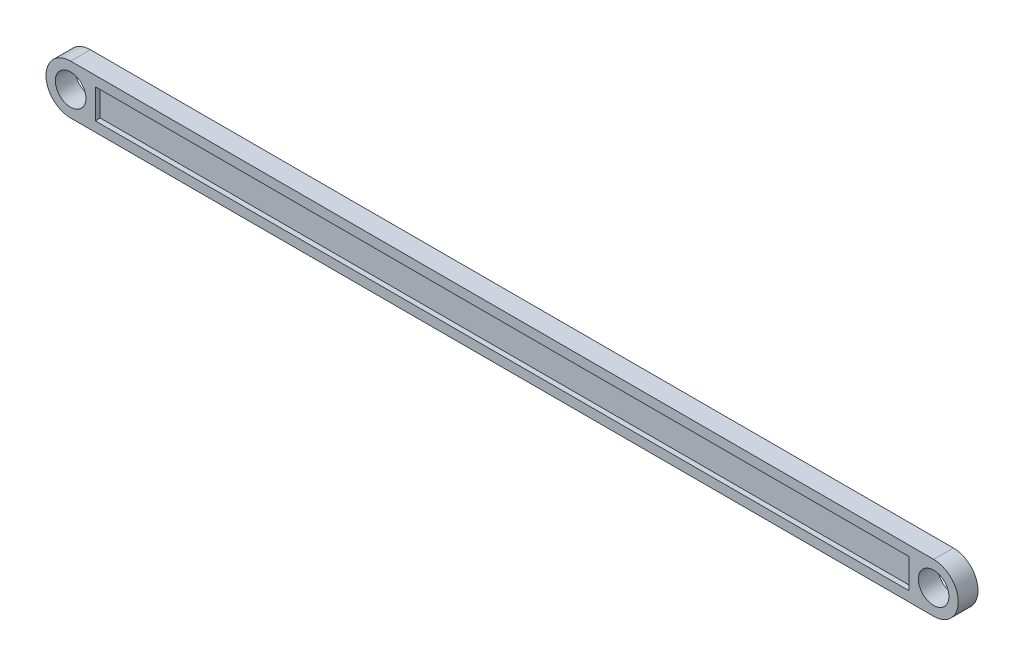
ISO-10303-21;
HEADER;
FILE_DESCRIPTION(('STEP AP214'),'2;1');
FILE_NAME('part.step','',(''),(''),'','','');
FILE_SCHEMA(('AUTOMOTIVE_DESIGN { 1 0 10303 214 1 1 1 1 }'));
ENDSEC;
DATA;
#1=APPLICATION_CONTEXT('core data for automotive mechanical design processes');
#2=APPLICATION_PROTOCOL_DEFINITION('international standard','automotive_design',2000,#1);
#3=PRODUCT_CONTEXT('',#1,'mechanical');
#4=PRODUCT('Part','Part','',(#3));
#5=PRODUCT_RELATED_PRODUCT_CATEGORY('part','',(#4));
#6=PRODUCT_DEFINITION_FORMATION('','',#4);
#7=PRODUCT_DEFINITION_CONTEXT('part definition',#1,'design');
#8=PRODUCT_DEFINITION('design','',#6,#7);
#9=PRODUCT_DEFINITION_SHAPE('','',#8);
#10=(LENGTH_UNIT() NAMED_UNIT(*) SI_UNIT(.MILLI.,.METRE.));
#11=(NAMED_UNIT(*) PLANE_ANGLE_UNIT() SI_UNIT($,.RADIAN.));
#12=(NAMED_UNIT(*) SI_UNIT($,.STERADIAN.) SOLID_ANGLE_UNIT());
#13=UNCERTAINTY_MEASURE_WITH_UNIT(LENGTH_MEASURE(1.E-05),#10,'distance_accuracy_value','');
#14=(GEOMETRIC_REPRESENTATION_CONTEXT(3) GLOBAL_UNCERTAINTY_ASSIGNED_CONTEXT((#13)) GLOBAL_UNIT_ASSIGNED_CONTEXT((#10,
#11,#12)) REPRESENTATION_CONTEXT('',''));
#15=CARTESIAN_POINT('',(0.,0.,0.));
#16=DIRECTION('',(0.,0.,1.));
#17=DIRECTION('',(1.,0.,0.));
#18=AXIS2_PLACEMENT_3D('',#15,#16,#17);
#19=CARTESIAN_POINT('',(175.,0.,4.));
#20=DIRECTION('',(0.,0.,1.));
#21=DIRECTION('',(1.,0.,0.));
#22=AXIS2_PLACEMENT_3D('',#19,#20,#21);
#23=PLANE('',#22);
#24=DIRECTION('',(0.,-1.,0.));
#25=VECTOR('',#24,1.);
#26=CARTESIAN_POINT('',(5.,-3.,4.));
#27=LINE('',#26,#25);
#28=CARTESIAN_POINT('',(5.,2.99999999999999,4.));
#29=VERTEX_POINT('',#28);
#30=CARTESIAN_POINT('',(5.,-3.,4.));
#31=VERTEX_POINT('',#30);
#32=EDGE_CURVE('E57',#29,#31,#27,.T.);
#33=ORIENTED_EDGE('',*,*,#32,.F.);
#34=DIRECTION('',(-1.,0.,0.));
#35=VECTOR('',#34,1.);
#36=CARTESIAN_POINT('',(5.,2.99999999999999,4.));
#37=LINE('',#36,#35);
#38=CARTESIAN_POINT('',(170.,2.99999999999999,4.));
#39=VERTEX_POINT('',#38);
#40=EDGE_CURVE('E165',#39,#29,#37,.T.);
#41=ORIENTED_EDGE('',*,*,#40,.F.);
#42=DIRECTION('',(0.,1.,0.));
#43=VECTOR('',#42,1.);
#44=CARTESIAN_POINT('',(170.,-3.,4.));
#45=LINE('',#44,#43);
#46=CARTESIAN_POINT('',(170.,-3.,4.));
#47=VERTEX_POINT('',#46);
#48=EDGE_CURVE('E179',#47,#39,#45,.T.);
#49=ORIENTED_EDGE('',*,*,#48,.F.);
#50=DIRECTION('',(1.,0.,0.));
#51=VECTOR('',#50,1.);
#52=CARTESIAN_POINT('',(5.,-3.,4.));
#53=LINE('',#52,#51);
#54=EDGE_CURVE('E176',#31,#47,#53,.T.);
#55=ORIENTED_EDGE('',*,*,#54,.F.);
#56=EDGE_LOOP('',(#33,#41,#49,#55));
#57=FACE_BOUND('',#56,.T.);
#58=CARTESIAN_POINT('',(0.,0.,4.));
#59=DIRECTION('',(0.,0.,1.));
#60=DIRECTION('',(1.,0.,0.));
#61=AXIS2_PLACEMENT_3D('',#58,#59,#60);
#62=CIRCLE('',#61,3.1);
#63=CARTESIAN_POINT('',(3.1,0.,4.));
#64=VERTEX_POINT('',#63);
#65=EDGE_CURVE('E198',#64,#64,#62,.T.);
#66=ORIENTED_EDGE('',*,*,#65,.F.);
#67=EDGE_LOOP('',(#66));
#68=FACE_BOUND('',#67,.T.);
#69=CARTESIAN_POINT('',(175.,0.,4.));
#70=DIRECTION('',(0.,0.,1.));
#71=DIRECTION('',(1.,0.,0.));
#72=AXIS2_PLACEMENT_3D('',#69,#70,#71);
#73=CIRCLE('',#72,4.99999999999999);
#74=CARTESIAN_POINT('',(175.,-4.99999999999999,4.));
#75=VERTEX_POINT('',#74);
#76=CARTESIAN_POINT('',(175.,4.99999999999999,4.));
#77=VERTEX_POINT('',#76);
#78=EDGE_CURVE('E204',#75,#77,#73,.T.);
#79=ORIENTED_EDGE('',*,*,#78,.T.);
#80=DIRECTION('',(-1.,0.,0.));
#81=VECTOR('',#80,1.);
#82=CARTESIAN_POINT('',(0.,5.,4.));
#83=LINE('',#82,#81);
#84=CARTESIAN_POINT('',(0.,5.,4.));
#85=VERTEX_POINT('',#84);
#86=EDGE_CURVE('E207',#77,#85,#83,.T.);
#87=ORIENTED_EDGE('',*,*,#86,.T.);
#88=CARTESIAN_POINT('',(0.,0.,4.));
#89=DIRECTION('',(0.,0.,1.));
#90=DIRECTION('',(1.,0.,0.));
#91=AXIS2_PLACEMENT_3D('',#88,#89,#90);
#92=CIRCLE('',#91,5.);
#93=CARTESIAN_POINT('',(0.,-5.,4.));
#94=VERTEX_POINT('',#93);
#95=EDGE_CURVE('E210',#85,#94,#92,.T.);
#96=ORIENTED_EDGE('',*,*,#95,.T.);
#97=DIRECTION('',(1.,0.,0.));
#98=VECTOR('',#97,1.);
#99=CARTESIAN_POINT('',(175.,-4.99999999999999,4.));
#100=LINE('',#99,#98);
#101=EDGE_CURVE('E212',#94,#75,#100,.T.);
#102=ORIENTED_EDGE('',*,*,#101,.T.);
#103=EDGE_LOOP('',(#79,#87,#96,#102));
#104=FACE_BOUND('',#103,.T.);
#105=CARTESIAN_POINT('',(175.,0.,4.));
#106=DIRECTION('',(0.,0.,1.));
#107=DIRECTION('',(1.,0.,0.));
#108=AXIS2_PLACEMENT_3D('',#105,#106,#107);
#109=CIRCLE('',#108,3.09999999999999);
#110=CARTESIAN_POINT('',(178.1,0.,4.));
#111=VERTEX_POINT('',#110);
#112=EDGE_CURVE('E192',#111,#111,#109,.T.);
#113=ORIENTED_EDGE('',*,*,#112,.F.);
#114=EDGE_LOOP('',(#113));
#115=FACE_BOUND('',#114,.T.);
#116=ADVANCED_FACE('F34',(#57,#68,#104,#115),#23,.T.);
#117=CARTESIAN_POINT('',(175.,0.,0.));
#118=DIRECTION('',(0.,0.,1.));
#119=DIRECTION('',(1.,0.,0.));
#120=AXIS2_PLACEMENT_3D('',#117,#118,#119);
#121=PLANE('',#120);
#122=DIRECTION('',(-1.,0.,0.));
#123=VECTOR('',#122,1.);
#124=CARTESIAN_POINT('',(170.,-3.,0.));
#125=LINE('',#124,#123);
#126=CARTESIAN_POINT('',(170.,-3.,0.));
#127=VERTEX_POINT('',#126);
#128=CARTESIAN_POINT('',(5.,-3.,0.));
#129=VERTEX_POINT('',#128);
#130=EDGE_CURVE('E152',#127,#129,#125,.T.);
#131=ORIENTED_EDGE('',*,*,#130,.F.);
#132=DIRECTION('',(0.,-1.,0.));
#133=VECTOR('',#132,1.);
#134=CARTESIAN_POINT('',(170.,-3.,0.));
#135=LINE('',#134,#133);
#136=CARTESIAN_POINT('',(170.,2.99999999999999,0.));
#137=VERTEX_POINT('',#136);
#138=EDGE_CURVE('E49',#137,#127,#135,.T.);
#139=ORIENTED_EDGE('',*,*,#138,.F.);
#140=DIRECTION('',(1.,0.,0.));
#141=VECTOR('',#140,1.);
#142=CARTESIAN_POINT('',(170.,2.99999999999999,0.));
#143=LINE('',#142,#141);
#144=CARTESIAN_POINT('',(5.,2.99999999999999,0.));
#145=VERTEX_POINT('',#144);
#146=EDGE_CURVE('E143',#145,#137,#143,.T.);
#147=ORIENTED_EDGE('',*,*,#146,.F.);
#148=DIRECTION('',(0.,1.,0.));
#149=VECTOR('',#148,1.);
#150=CARTESIAN_POINT('',(5.,-3.,0.));
#151=LINE('',#150,#149);
#152=EDGE_CURVE('E146',#129,#145,#151,.T.);
#153=ORIENTED_EDGE('',*,*,#152,.F.);
#154=EDGE_LOOP('',(#131,#139,#147,#153));
#155=FACE_BOUND('',#154,.T.);
#156=CARTESIAN_POINT('',(175.,0.,0.));
#157=DIRECTION('',(0.,0.,1.));
#158=DIRECTION('',(1.,0.,0.));
#159=AXIS2_PLACEMENT_3D('',#156,#157,#158);
#160=CIRCLE('',#159,4.99999999999999);
#161=CARTESIAN_POINT('',(175.,-4.99999999999999,0.));
#162=VERTEX_POINT('',#161);
#163=CARTESIAN_POINT('',(175.,4.99999999999999,0.));
#164=VERTEX_POINT('',#163);
#165=EDGE_CURVE('E201',#162,#164,#160,.T.);
#166=ORIENTED_EDGE('',*,*,#165,.F.);
#167=DIRECTION('',(1.,0.,0.));
#168=VECTOR('',#167,1.);
#169=CARTESIAN_POINT('',(175.,-4.99999999999999,0.));
#170=LINE('',#169,#168);
#171=CARTESIAN_POINT('',(0.,-5.,0.));
#172=VERTEX_POINT('',#171);
#173=EDGE_CURVE('E208',#172,#162,#170,.T.);
#174=ORIENTED_EDGE('',*,*,#173,.F.);
#175=CARTESIAN_POINT('',(0.,0.,0.));
#176=DIRECTION('',(0.,0.,1.));
#177=DIRECTION('',(1.,0.,0.));
#178=AXIS2_PLACEMENT_3D('',#175,#176,#177);
#179=CIRCLE('',#178,5.);
#180=CARTESIAN_POINT('',(0.,5.,0.));
#181=VERTEX_POINT('',#180);
#182=EDGE_CURVE('E219',#181,#172,#179,.T.);
#183=ORIENTED_EDGE('',*,*,#182,.F.);
#184=DIRECTION('',(-1.,0.,0.));
#185=VECTOR('',#184,1.);
#186=CARTESIAN_POINT('',(0.,5.,0.));
#187=LINE('',#186,#185);
#188=EDGE_CURVE('E217',#164,#181,#187,.T.);
#189=ORIENTED_EDGE('',*,*,#188,.F.);
#190=EDGE_LOOP('',(#166,#174,#183,#189));
#191=FACE_BOUND('',#190,.T.);
#192=CARTESIAN_POINT('',(0.,0.,0.));
#193=DIRECTION('',(0.,0.,1.));
#194=DIRECTION('',(1.,0.,0.));
#195=AXIS2_PLACEMENT_3D('',#192,#193,#194);
#196=CIRCLE('',#195,3.1);
#197=CARTESIAN_POINT('',(3.1,0.,0.));
#198=VERTEX_POINT('',#197);
#199=EDGE_CURVE('E195',#198,#198,#196,.T.);
#200=ORIENTED_EDGE('',*,*,#199,.T.);
#201=EDGE_LOOP('',(#200));
#202=FACE_BOUND('',#201,.T.);
#203=CARTESIAN_POINT('',(175.,0.,0.));
#204=DIRECTION('',(0.,0.,1.));
#205=DIRECTION('',(1.,0.,0.));
#206=AXIS2_PLACEMENT_3D('',#203,#204,#205);
#207=CIRCLE('',#206,3.09999999999999);
#208=CARTESIAN_POINT('',(178.1,0.,0.));
#209=VERTEX_POINT('',#208);
#210=EDGE_CURVE('E186',#209,#209,#207,.T.);
#211=ORIENTED_EDGE('',*,*,#210,.T.);
#212=EDGE_LOOP('',(#211));
#213=FACE_BOUND('',#212,.T.);
#214=ADVANCED_FACE('F237',(#155,#191,#202,#213),#121,.F.);
#215=CARTESIAN_POINT('',(175.,0.,4.));
#216=DIRECTION('',(0.,0.,-1.));
#217=DIRECTION('',(-1.,0.,0.));
#218=AXIS2_PLACEMENT_3D('',#215,#216,#217);
#219=CYLINDRICAL_SURFACE('',#218,4.99999999999999);
#220=ORIENTED_EDGE('',*,*,#165,.T.);
#221=DIRECTION('',(0.,0.,-1.));
#222=VECTOR('',#221,1.);
#223=CARTESIAN_POINT('',(175.,4.99999999999999,4.));
#224=LINE('',#223,#222);
#225=EDGE_CURVE('E11',#77,#164,#224,.T.);
#226=ORIENTED_EDGE('',*,*,#225,.F.);
#227=ORIENTED_EDGE('',*,*,#78,.F.);
#228=DIRECTION('',(0.,0.,-1.));
#229=VECTOR('',#228,1.);
#230=CARTESIAN_POINT('',(175.,-4.99999999999999,4.));
#231=LINE('',#230,#229);
#232=EDGE_CURVE('E214',#75,#162,#231,.T.);
#233=ORIENTED_EDGE('',*,*,#232,.T.);
#234=EDGE_LOOP('',(#220,#226,#227,#233));
#235=FACE_BOUND('',#234,.T.);
#236=ADVANCED_FACE('F36',(#235),#219,.T.);
#237=CARTESIAN_POINT('',(0.,5.,4.));
#238=DIRECTION('',(0.,-1.,0.));
#239=DIRECTION('',(1.,0.,0.));
#240=AXIS2_PLACEMENT_3D('',#237,#238,#239);
#241=PLANE('',#240);
#242=ORIENTED_EDGE('',*,*,#188,.T.);
#243=DIRECTION('',(0.,0.,-1.));
#244=VECTOR('',#243,1.);
#245=CARTESIAN_POINT('',(0.,5.,4.));
#246=LINE('',#245,#244);
#247=EDGE_CURVE('E42',#85,#181,#246,.T.);
#248=ORIENTED_EDGE('',*,*,#247,.F.);
#249=ORIENTED_EDGE('',*,*,#86,.F.);
#250=ORIENTED_EDGE('',*,*,#225,.T.);
#251=EDGE_LOOP('',(#242,#248,#249,#250));
#252=FACE_BOUND('',#251,.T.);
#253=ADVANCED_FACE('F248',(#252),#241,.F.);
#254=CARTESIAN_POINT('',(0.,0.,4.));
#255=DIRECTION('',(0.,0.,-1.));
#256=DIRECTION('',(-1.,0.,0.));
#257=AXIS2_PLACEMENT_3D('',#254,#255,#256);
#258=CYLINDRICAL_SURFACE('',#257,5.);
#259=ORIENTED_EDGE('',*,*,#182,.T.);
#260=DIRECTION('',(0.,0.,-1.));
#261=VECTOR('',#260,1.);
#262=CARTESIAN_POINT('',(0.,-5.,4.));
#263=LINE('',#262,#261);
#264=EDGE_CURVE('E224',#94,#172,#263,.T.);
#265=ORIENTED_EDGE('',*,*,#264,.F.);
#266=ORIENTED_EDGE('',*,*,#95,.F.);
#267=ORIENTED_EDGE('',*,*,#247,.T.);
#268=EDGE_LOOP('',(#259,#265,#266,#267));
#269=FACE_BOUND('',#268,.T.);
#270=ADVANCED_FACE('F231',(#269),#258,.T.);
#271=CARTESIAN_POINT('',(175.,-4.99999999999999,4.));
#272=DIRECTION('',(0.,1.,0.));
#273=DIRECTION('',(-1.,0.,0.));
#274=AXIS2_PLACEMENT_3D('',#271,#272,#273);
#275=PLANE('',#274);
#276=ORIENTED_EDGE('',*,*,#173,.T.);
#277=ORIENTED_EDGE('',*,*,#232,.F.);
#278=ORIENTED_EDGE('',*,*,#101,.F.);
#279=ORIENTED_EDGE('',*,*,#264,.T.);
#280=EDGE_LOOP('',(#276,#277,#278,#279));
#281=FACE_BOUND('',#280,.T.);
#282=ADVANCED_FACE('F241',(#281),#275,.F.);
#283=CARTESIAN_POINT('',(0.,0.,4.));
#284=DIRECTION('',(0.,0.,-1.));
#285=DIRECTION('',(-1.,0.,0.));
#286=AXIS2_PLACEMENT_3D('',#283,#284,#285);
#287=CYLINDRICAL_SURFACE('',#286,3.1);
#288=ORIENTED_EDGE('',*,*,#65,.T.);
#289=EDGE_LOOP('',(#288));
#290=FACE_BOUND('',#289,.T.);
#291=ORIENTED_EDGE('',*,*,#199,.F.);
#292=EDGE_LOOP('',(#291));
#293=FACE_BOUND('',#292,.T.);
#294=ADVANCED_FACE('F265',(#290,#293),#287,.F.);
#295=CARTESIAN_POINT('',(175.,0.,4.));
#296=DIRECTION('',(0.,0.,-1.));
#297=DIRECTION('',(-1.,0.,0.));
#298=AXIS2_PLACEMENT_3D('',#295,#296,#297);
#299=CYLINDRICAL_SURFACE('',#298,3.09999999999999);
#300=ORIENTED_EDGE('',*,*,#112,.T.);
#301=EDGE_LOOP('',(#300));
#302=FACE_BOUND('',#301,.T.);
#303=ORIENTED_EDGE('',*,*,#210,.F.);
#304=EDGE_LOOP('',(#303));
#305=FACE_BOUND('',#304,.T.);
#306=ADVANCED_FACE('F272',(#302,#305),#299,.F.);
#307=CARTESIAN_POINT('',(5.,-3.,3.));
#308=DIRECTION('',(-1.,0.,0.));
#309=DIRECTION('',(0.,0.,1.));
#310=AXIS2_PLACEMENT_3D('',#307,#308,#309);
#311=PLANE('',#310);
#312=ORIENTED_EDGE('',*,*,#32,.T.);
#313=DIRECTION('',(0.,0.,1.));
#314=VECTOR('',#313,1.);
#315=CARTESIAN_POINT('',(5.,-3.,3.));
#316=LINE('',#315,#314);
#317=CARTESIAN_POINT('',(5.,-3.,3.));
#318=VERTEX_POINT('',#317);
#319=EDGE_CURVE('E174',#318,#31,#316,.T.);
#320=ORIENTED_EDGE('',*,*,#319,.F.);
#321=DIRECTION('',(0.,-1.,0.));
#322=VECTOR('',#321,1.);
#323=CARTESIAN_POINT('',(5.,-3.,3.));
#324=LINE('',#323,#322);
#325=CARTESIAN_POINT('',(5.,2.99999999999999,3.));
#326=VERTEX_POINT('',#325);
#327=EDGE_CURVE('E161',#326,#318,#324,.T.);
#328=ORIENTED_EDGE('',*,*,#327,.F.);
#329=DIRECTION('',(0.,0.,1.));
#330=VECTOR('',#329,1.);
#331=CARTESIAN_POINT('',(5.,2.99999999999999,3.));
#332=LINE('',#331,#330);
#333=EDGE_CURVE('E184',#326,#29,#332,.T.);
#334=ORIENTED_EDGE('',*,*,#333,.T.);
#335=EDGE_LOOP('',(#312,#320,#328,#334));
#336=FACE_BOUND('',#335,.T.);
#337=ADVANCED_FACE('F277',(#336),#311,.F.);
#338=CARTESIAN_POINT('',(5.,2.99999999999999,3.));
#339=DIRECTION('',(0.,1.,0.));
#340=DIRECTION('',(0.,0.,1.));
#341=AXIS2_PLACEMENT_3D('',#338,#339,#340);
#342=PLANE('',#341);
#343=ORIENTED_EDGE('',*,*,#40,.T.);
#344=ORIENTED_EDGE('',*,*,#333,.F.);
#345=DIRECTION('',(-1.,0.,0.));
#346=VECTOR('',#345,1.);
#347=CARTESIAN_POINT('',(5.,2.99999999999999,3.));
#348=LINE('',#347,#346);
#349=CARTESIAN_POINT('',(170.,2.99999999999999,3.));
#350=VERTEX_POINT('',#349);
#351=EDGE_CURVE('E171',#350,#326,#348,.T.);
#352=ORIENTED_EDGE('',*,*,#351,.F.);
#353=DIRECTION('',(0.,0.,1.));
#354=VECTOR('',#353,1.);
#355=CARTESIAN_POINT('',(170.,2.99999999999999,3.));
#356=LINE('',#355,#354);
#357=EDGE_CURVE('E187',#350,#39,#356,.T.);
#358=ORIENTED_EDGE('',*,*,#357,.T.);
#359=EDGE_LOOP('',(#343,#344,#352,#358));
#360=FACE_BOUND('',#359,.T.);
#361=ADVANCED_FACE('F288',(#360),#342,.F.);
#362=CARTESIAN_POINT('',(170.,-3.,3.));
#363=DIRECTION('',(1.,0.,0.));
#364=DIRECTION('',(0.,0.,-1.));
#365=AXIS2_PLACEMENT_3D('',#362,#363,#364);
#366=PLANE('',#365);
#367=ORIENTED_EDGE('',*,*,#48,.T.);
#368=ORIENTED_EDGE('',*,*,#357,.F.);
#369=DIRECTION('',(0.,1.,0.));
#370=VECTOR('',#369,1.);
#371=CARTESIAN_POINT('',(170.,-3.,3.));
#372=LINE('',#371,#370);
#373=CARTESIAN_POINT('',(170.,-3.,3.));
#374=VERTEX_POINT('',#373);
#375=EDGE_CURVE('E168',#374,#350,#372,.T.);
#376=ORIENTED_EDGE('',*,*,#375,.F.);
#377=DIRECTION('',(0.,0.,1.));
#378=VECTOR('',#377,1.);
#379=CARTESIAN_POINT('',(170.,-3.,3.));
#380=LINE('',#379,#378);
#381=EDGE_CURVE('E189',#374,#47,#380,.T.);
#382=ORIENTED_EDGE('',*,*,#381,.T.);
#383=EDGE_LOOP('',(#367,#368,#376,#382));
#384=FACE_BOUND('',#383,.T.);
#385=ADVANCED_FACE('F295',(#384),#366,.F.);
#386=CARTESIAN_POINT('',(5.,-3.,3.));
#387=DIRECTION('',(0.,-1.,0.));
#388=DIRECTION('',(0.,0.,-1.));
#389=AXIS2_PLACEMENT_3D('',#386,#387,#388);
#390=PLANE('',#389);
#391=ORIENTED_EDGE('',*,*,#54,.T.);
#392=ORIENTED_EDGE('',*,*,#381,.F.);
#393=DIRECTION('',(1.,0.,0.));
#394=VECTOR('',#393,1.);
#395=CARTESIAN_POINT('',(5.,-3.,3.));
#396=LINE('',#395,#394);
#397=EDGE_CURVE('E164',#318,#374,#396,.T.);
#398=ORIENTED_EDGE('',*,*,#397,.F.);
#399=ORIENTED_EDGE('',*,*,#319,.T.);
#400=EDGE_LOOP('',(#391,#392,#398,#399));
#401=FACE_BOUND('',#400,.T.);
#402=ADVANCED_FACE('F291',(#401),#390,.F.);
#403=CARTESIAN_POINT('',(0.,0.,3.));
#404=DIRECTION('',(0.,0.,-1.));
#405=DIRECTION('',(-1.,0.,0.));
#406=AXIS2_PLACEMENT_3D('',#403,#404,#405);
#407=PLANE('',#406);
#408=ORIENTED_EDGE('',*,*,#327,.T.);
#409=ORIENTED_EDGE('',*,*,#397,.T.);
#410=ORIENTED_EDGE('',*,*,#375,.T.);
#411=ORIENTED_EDGE('',*,*,#351,.T.);
#412=EDGE_LOOP('',(#408,#409,#410,#411));
#413=FACE_BOUND('',#412,.T.);
#414=ADVANCED_FACE('F294',(#413),#407,.F.);
#415=CARTESIAN_POINT('',(170.,-3.,1.));
#416=DIRECTION('',(1.,0.,0.));
#417=DIRECTION('',(0.,0.,-1.));
#418=AXIS2_PLACEMENT_3D('',#415,#416,#417);
#419=PLANE('',#418);
#420=ORIENTED_EDGE('',*,*,#138,.T.);
#421=DIRECTION('',(0.,0.,-1.));
#422=VECTOR('',#421,1.);
#423=CARTESIAN_POINT('',(170.,-3.,1.));
#424=LINE('',#423,#422);
#425=CARTESIAN_POINT('',(170.,-3.,1.));
#426=VERTEX_POINT('',#425);
#427=EDGE_CURVE('E121',#426,#127,#424,.T.);
#428=ORIENTED_EDGE('',*,*,#427,.F.);
#429=DIRECTION('',(0.,-1.,0.));
#430=VECTOR('',#429,1.);
#431=CARTESIAN_POINT('',(170.,-3.,1.));
#432=LINE('',#431,#430);
#433=CARTESIAN_POINT('',(170.,2.99999999999999,1.));
#434=VERTEX_POINT('',#433);
#435=EDGE_CURVE('E125',#434,#426,#432,.T.);
#436=ORIENTED_EDGE('',*,*,#435,.F.);
#437=DIRECTION('',(0.,0.,-1.));
#438=VECTOR('',#437,1.);
#439=CARTESIAN_POINT('',(170.,2.99999999999999,1.));
#440=LINE('',#439,#438);
#441=EDGE_CURVE('E156',#434,#137,#440,.T.);
#442=ORIENTED_EDGE('',*,*,#441,.T.);
#443=EDGE_LOOP('',(#420,#428,#436,#442));
#444=FACE_BOUND('',#443,.T.);
#445=ADVANCED_FACE('F123',(#444),#419,.F.);
#446=CARTESIAN_POINT('',(170.,2.99999999999999,1.));
#447=DIRECTION('',(0.,1.,0.));
#448=DIRECTION('',(0.,0.,1.));
#449=AXIS2_PLACEMENT_3D('',#446,#447,#448);
#450=PLANE('',#449);
#451=ORIENTED_EDGE('',*,*,#146,.T.);
#452=ORIENTED_EDGE('',*,*,#441,.F.);
#453=DIRECTION('',(1.,0.,0.));
#454=VECTOR('',#453,1.);
#455=CARTESIAN_POINT('',(170.,2.99999999999999,1.));
#456=LINE('',#455,#454);
#457=CARTESIAN_POINT('',(5.,2.99999999999999,1.));
#458=VERTEX_POINT('',#457);
#459=EDGE_CURVE('E131',#458,#434,#456,.T.);
#460=ORIENTED_EDGE('',*,*,#459,.F.);
#461=DIRECTION('',(0.,0.,-1.));
#462=VECTOR('',#461,1.);
#463=CARTESIAN_POINT('',(5.,2.99999999999999,1.));
#464=LINE('',#463,#462);
#465=EDGE_CURVE('E158',#458,#145,#464,.T.);
#466=ORIENTED_EDGE('',*,*,#465,.T.);
#467=EDGE_LOOP('',(#451,#452,#460,#466));
#468=FACE_BOUND('',#467,.T.);
#469=ADVANCED_FACE('F308',(#468),#450,.F.);
#470=CARTESIAN_POINT('',(5.,-3.,1.));
#471=DIRECTION('',(-1.,0.,0.));
#472=DIRECTION('',(0.,0.,1.));
#473=AXIS2_PLACEMENT_3D('',#470,#471,#472);
#474=PLANE('',#473);
#475=ORIENTED_EDGE('',*,*,#152,.T.);
#476=ORIENTED_EDGE('',*,*,#465,.F.);
#477=DIRECTION('',(0.,1.,0.));
#478=VECTOR('',#477,1.);
#479=CARTESIAN_POINT('',(5.,-3.,1.));
#480=LINE('',#479,#478);
#481=CARTESIAN_POINT('',(5.,-3.,1.));
#482=VERTEX_POINT('',#481);
#483=EDGE_CURVE('E139',#482,#458,#480,.T.);
#484=ORIENTED_EDGE('',*,*,#483,.F.);
#485=DIRECTION('',(0.,0.,-1.));
#486=VECTOR('',#485,1.);
#487=CARTESIAN_POINT('',(5.,-3.,1.));
#488=LINE('',#487,#486);
#489=EDGE_CURVE('E130',#482,#129,#488,.T.);
#490=ORIENTED_EDGE('',*,*,#489,.T.);
#491=EDGE_LOOP('',(#475,#476,#484,#490));
#492=FACE_BOUND('',#491,.T.);
#493=ADVANCED_FACE('F311',(#492),#474,.F.);
#494=CARTESIAN_POINT('',(170.,-3.,1.));
#495=DIRECTION('',(0.,-1.,0.));
#496=DIRECTION('',(0.,0.,-1.));
#497=AXIS2_PLACEMENT_3D('',#494,#495,#496);
#498=PLANE('',#497);
#499=ORIENTED_EDGE('',*,*,#130,.T.);
#500=ORIENTED_EDGE('',*,*,#489,.F.);
#501=DIRECTION('',(-1.,0.,0.));
#502=VECTOR('',#501,1.);
#503=CARTESIAN_POINT('',(170.,-3.,1.));
#504=LINE('',#503,#502);
#505=EDGE_CURVE('E134',#426,#482,#504,.T.);
#506=ORIENTED_EDGE('',*,*,#505,.F.);
#507=ORIENTED_EDGE('',*,*,#427,.T.);
#508=EDGE_LOOP('',(#499,#500,#506,#507));
#509=FACE_BOUND('',#508,.T.);
#510=ADVANCED_FACE('F135',(#509),#498,.F.);
#511=CARTESIAN_POINT('',(0.,0.,1.));
#512=DIRECTION('',(0.,0.,1.));
#513=DIRECTION('',(1.,0.,0.));
#514=AXIS2_PLACEMENT_3D('',#511,#512,#513);
#515=PLANE('',#514);
#516=ORIENTED_EDGE('',*,*,#435,.T.);
#517=ORIENTED_EDGE('',*,*,#505,.T.);
#518=ORIENTED_EDGE('',*,*,#483,.T.);
#519=ORIENTED_EDGE('',*,*,#459,.T.);
#520=EDGE_LOOP('',(#516,#517,#518,#519));
#521=FACE_BOUND('',#520,.T.);
#522=ADVANCED_FACE('F141',(#521),#515,.F.);
#523=CLOSED_SHELL('',(#116,#214,#236,#253,#270,#282,#294,#306,#337,#361,#385,#402,#414,#445,
#469,#493,#510,#522));
#524=MANIFOLD_SOLID_BREP('B2',#523);
#525=ADVANCED_BREP_SHAPE_REPRESENTATION('',(#18,#524),#14);
#526=SHAPE_DEFINITION_REPRESENTATION(#9,#525);
ENDSEC;
END-ISO-10303-21;
